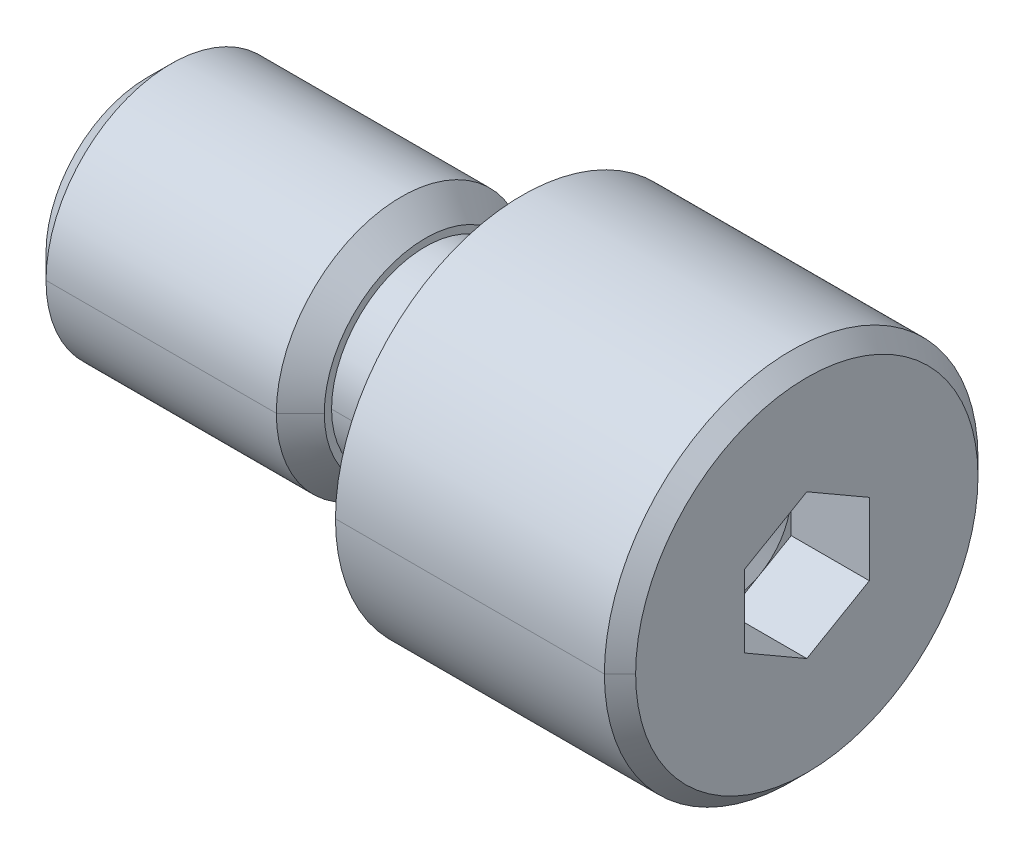
ISO-10303-21;
HEADER;
FILE_DESCRIPTION(('STEP AP214'),'2;1');
FILE_NAME('part.step','',(''),(''),'','','');
FILE_SCHEMA(('AUTOMOTIVE_DESIGN { 1 0 10303 214 1 1 1 1 }'));
ENDSEC;
DATA;
#1=APPLICATION_CONTEXT('core data for automotive mechanical design processes');
#2=APPLICATION_PROTOCOL_DEFINITION('international standard','automotive_design',2000,#1);
#3=PRODUCT_CONTEXT('',#1,'mechanical');
#4=PRODUCT('Part','Part','',(#3));
#5=PRODUCT_RELATED_PRODUCT_CATEGORY('part','',(#4));
#6=PRODUCT_DEFINITION_FORMATION('','',#4);
#7=PRODUCT_DEFINITION_CONTEXT('part definition',#1,'design');
#8=PRODUCT_DEFINITION('design','',#6,#7);
#9=PRODUCT_DEFINITION_SHAPE('','',#8);
#10=(LENGTH_UNIT() NAMED_UNIT(*) SI_UNIT(.MILLI.,.METRE.));
#11=(NAMED_UNIT(*) PLANE_ANGLE_UNIT() SI_UNIT($,.RADIAN.));
#12=(NAMED_UNIT(*) SI_UNIT($,.STERADIAN.) SOLID_ANGLE_UNIT());
#13=UNCERTAINTY_MEASURE_WITH_UNIT(LENGTH_MEASURE(1.E-05),#10,'distance_accuracy_value','');
#14=(GEOMETRIC_REPRESENTATION_CONTEXT(3) GLOBAL_UNCERTAINTY_ASSIGNED_CONTEXT((#13)) GLOBAL_UNIT_ASSIGNED_CONTEXT((#10,
#11,#12)) REPRESENTATION_CONTEXT('',''));
#15=CARTESIAN_POINT('',(0.,0.,0.));
#16=DIRECTION('',(0.,0.,1.));
#17=DIRECTION('',(1.,0.,0.));
#18=AXIS2_PLACEMENT_3D('',#15,#16,#17);
#19=CARTESIAN_POINT('',(18.6,0.,0.));
#20=DIRECTION('',(1.,0.,0.));
#21=DIRECTION('',(0.,0.,-1.));
#22=AXIS2_PLACEMENT_3D('',#19,#20,#21);
#23=PLANE('',#22);
#24=DIRECTION('',(0.,0.499999999999983,-0.866025403784448));
#25=VECTOR('',#24,1.);
#26=CARTESIAN_POINT('',(18.6,-2.3094010767585,0.));
#27=LINE('',#26,#25);
#28=CARTESIAN_POINT('',(18.6,-2.3094010767585,0.));
#29=VERTEX_POINT('',#28);
#30=CARTESIAN_POINT('',(18.6,-1.73205080756889,-0.999999999999966));
#31=VERTEX_POINT('',#30);
#32=EDGE_CURVE('E11',#29,#31,#27,.T.);
#33=ORIENTED_EDGE('',*,*,#32,.T.);
#34=CARTESIAN_POINT('',(18.6,0.,0.));
#35=DIRECTION('',(-1.,0.,0.));
#36=DIRECTION('',(0.,0.,-1.));
#37=AXIS2_PLACEMENT_3D('',#34,#35,#36);
#38=CIRCLE('',#37,2.);
#39=CARTESIAN_POINT('',(18.6,-1.73205080756889,0.999999999999966));
#40=VERTEX_POINT('',#39);
#41=EDGE_CURVE('E25',#31,#40,#38,.T.);
#42=ORIENTED_EDGE('',*,*,#41,.T.);
#43=DIRECTION('',(0.,-0.499999999999983,-0.866025403784448));
#44=VECTOR('',#43,1.);
#45=CARTESIAN_POINT('',(18.6,-1.1547005383793,2.));
#46=LINE('',#45,#44);
#47=EDGE_CURVE('E459',#40,#29,#46,.T.);
#48=ORIENTED_EDGE('',*,*,#47,.T.);
#49=EDGE_LOOP('',(#33,#42,#48));
#50=FACE_BOUND('',#49,.T.);
#51=ADVANCED_FACE('F17',(#50),#23,.T.);
#52=CARTESIAN_POINT('',(18.6,-1.1547005383793,2.));
#53=DIRECTION('',(0.,-0.866025403784448,0.499999999999983));
#54=DIRECTION('',(0.,-0.499999999999983,-0.866025403784448));
#55=AXIS2_PLACEMENT_3D('',#52,#53,#54);
#56=PLANE('',#55);
#57=DIRECTION('',(0.,-0.499999999999983,-0.866025403784448));
#58=VECTOR('',#57,1.);
#59=CARTESIAN_POINT('',(21.1,-1.1547005383793,2.));
#60=LINE('',#59,#58);
#61=CARTESIAN_POINT('',(21.1,-1.1547005383793,2.));
#62=VERTEX_POINT('',#61);
#63=CARTESIAN_POINT('',(21.1,-2.3094010767585,0.));
#64=VERTEX_POINT('',#63);
#65=EDGE_CURVE('E455',#62,#64,#60,.T.);
#66=ORIENTED_EDGE('',*,*,#65,.T.);
#67=DIRECTION('',(1.,0.,0.));
#68=VECTOR('',#67,1.);
#69=CARTESIAN_POINT('',(18.6,-2.3094010767585,0.));
#70=LINE('',#69,#68);
#71=EDGE_CURVE('E450',#29,#64,#70,.T.);
#72=ORIENTED_EDGE('',*,*,#71,.F.);
#73=ORIENTED_EDGE('',*,*,#47,.F.);
#74=DIRECTION('',(0.,-0.499999999999983,-0.866025403784448));
#75=VECTOR('',#74,1.);
#76=CARTESIAN_POINT('',(18.6,-1.1547005383793,2.));
#77=LINE('',#76,#75);
#78=CARTESIAN_POINT('',(18.6,-1.1547005383793,2.));
#79=VERTEX_POINT('',#78);
#80=EDGE_CURVE('E445',#79,#40,#77,.T.);
#81=ORIENTED_EDGE('',*,*,#80,.F.);
#82=DIRECTION('',(1.,0.,0.));
#83=VECTOR('',#82,1.);
#84=CARTESIAN_POINT('',(18.6,-1.1547005383793,2.));
#85=LINE('',#84,#83);
#86=EDGE_CURVE('E441',#79,#62,#85,.T.);
#87=ORIENTED_EDGE('',*,*,#86,.T.);
#88=EDGE_LOOP('',(#66,#72,#73,#81,#87));
#89=FACE_BOUND('',#88,.T.);
#90=ADVANCED_FACE('F470',(#89),#56,.F.);
#91=CARTESIAN_POINT('',(18.6,1.1547005383793,2.));
#92=DIRECTION('',(0.,0.,1.));
#93=DIRECTION('',(1.,0.,0.));
#94=AXIS2_PLACEMENT_3D('',#91,#92,#93);
#95=PLANE('',#94);
#96=DIRECTION('',(0.,-1.,0.));
#97=VECTOR('',#96,1.);
#98=CARTESIAN_POINT('',(21.1,1.1547005383793,2.));
#99=LINE('',#98,#97);
#100=CARTESIAN_POINT('',(21.1,1.1547005383793,2.));
#101=VERTEX_POINT('',#100);
#102=EDGE_CURVE('E436',#101,#62,#99,.T.);
#103=ORIENTED_EDGE('',*,*,#102,.T.);
#104=ORIENTED_EDGE('',*,*,#86,.F.);
#105=DIRECTION('',(0.,-1.,0.));
#106=VECTOR('',#105,1.);
#107=CARTESIAN_POINT('',(18.6,1.1547005383793,2.));
#108=LINE('',#107,#106);
#109=CARTESIAN_POINT('',(18.6,0.,2.));
#110=VERTEX_POINT('',#109);
#111=EDGE_CURVE('E431',#110,#79,#108,.T.);
#112=ORIENTED_EDGE('',*,*,#111,.F.);
#113=DIRECTION('',(0.,-1.,0.));
#114=VECTOR('',#113,1.);
#115=CARTESIAN_POINT('',(18.6,1.1547005383793,2.));
#116=LINE('',#115,#114);
#117=CARTESIAN_POINT('',(18.6,1.1547005383793,2.));
#118=VERTEX_POINT('',#117);
#119=EDGE_CURVE('E426',#118,#110,#116,.T.);
#120=ORIENTED_EDGE('',*,*,#119,.F.);
#121=DIRECTION('',(1.,0.,0.));
#122=VECTOR('',#121,1.);
#123=CARTESIAN_POINT('',(18.6,1.1547005383793,2.));
#124=LINE('',#123,#122);
#125=EDGE_CURVE('E422',#118,#101,#124,.T.);
#126=ORIENTED_EDGE('',*,*,#125,.T.);
#127=EDGE_LOOP('',(#103,#104,#112,#120,#126));
#128=FACE_BOUND('',#127,.T.);
#129=ADVANCED_FACE('F488',(#128),#95,.F.);
#130=CARTESIAN_POINT('',(18.6,2.3094010767585,0.));
#131=DIRECTION('',(0.,0.866025403784448,0.499999999999983));
#132=DIRECTION('',(0.,-0.499999999999983,0.866025403784448));
#133=AXIS2_PLACEMENT_3D('',#130,#131,#132);
#134=PLANE('',#133);
#135=DIRECTION('',(0.,-0.499999999999983,0.866025403784448));
#136=VECTOR('',#135,1.);
#137=CARTESIAN_POINT('',(21.1,2.3094010767585,0.));
#138=LINE('',#137,#136);
#139=CARTESIAN_POINT('',(21.1,2.3094010767585,0.));
#140=VERTEX_POINT('',#139);
#141=EDGE_CURVE('E417',#140,#101,#138,.T.);
#142=ORIENTED_EDGE('',*,*,#141,.T.);
#143=ORIENTED_EDGE('',*,*,#125,.F.);
#144=DIRECTION('',(0.,-0.499999999999983,0.866025403784448));
#145=VECTOR('',#144,1.);
#146=CARTESIAN_POINT('',(18.6,2.3094010767585,0.));
#147=LINE('',#146,#145);
#148=CARTESIAN_POINT('',(18.6,1.73205080756889,0.999999999999966));
#149=VERTEX_POINT('',#148);
#150=EDGE_CURVE('E412',#149,#118,#147,.T.);
#151=ORIENTED_EDGE('',*,*,#150,.F.);
#152=DIRECTION('',(0.,-0.499999999999983,0.866025403784448));
#153=VECTOR('',#152,1.);
#154=CARTESIAN_POINT('',(18.6,2.3094010767585,0.));
#155=LINE('',#154,#153);
#156=CARTESIAN_POINT('',(18.6,2.3094010767585,0.));
#157=VERTEX_POINT('',#156);
#158=EDGE_CURVE('E407',#157,#149,#155,.T.);
#159=ORIENTED_EDGE('',*,*,#158,.F.);
#160=DIRECTION('',(1.,0.,0.));
#161=VECTOR('',#160,1.);
#162=CARTESIAN_POINT('',(18.6,2.3094010767585,0.));
#163=LINE('',#162,#161);
#164=EDGE_CURVE('E403',#157,#140,#163,.T.);
#165=ORIENTED_EDGE('',*,*,#164,.T.);
#166=EDGE_LOOP('',(#142,#143,#151,#159,#165));
#167=FACE_BOUND('',#166,.T.);
#168=ADVANCED_FACE('F512',(#167),#134,.F.);
#169=CARTESIAN_POINT('',(18.6,1.1547005383793,-2.));
#170=DIRECTION('',(0.,0.866025403784448,-0.499999999999983));
#171=DIRECTION('',(0.,0.499999999999983,0.866025403784448));
#172=AXIS2_PLACEMENT_3D('',#169,#170,#171);
#173=PLANE('',#172);
#174=DIRECTION('',(0.,0.499999999999983,0.866025403784448));
#175=VECTOR('',#174,1.);
#176=CARTESIAN_POINT('',(21.1,1.1547005383793,-2.));
#177=LINE('',#176,#175);
#178=CARTESIAN_POINT('',(21.1,1.1547005383793,-2.));
#179=VERTEX_POINT('',#178);
#180=EDGE_CURVE('E398',#179,#140,#177,.T.);
#181=ORIENTED_EDGE('',*,*,#180,.T.);
#182=ORIENTED_EDGE('',*,*,#164,.F.);
#183=DIRECTION('',(0.,0.499999999999983,0.866025403784448));
#184=VECTOR('',#183,1.);
#185=CARTESIAN_POINT('',(18.6,1.1547005383793,-2.));
#186=LINE('',#185,#184);
#187=CARTESIAN_POINT('',(18.6,1.73205080756889,-0.999999999999966));
#188=VERTEX_POINT('',#187);
#189=EDGE_CURVE('E393',#188,#157,#186,.T.);
#190=ORIENTED_EDGE('',*,*,#189,.F.);
#191=DIRECTION('',(0.,0.499999999999983,0.866025403784448));
#192=VECTOR('',#191,1.);
#193=CARTESIAN_POINT('',(18.6,1.1547005383793,-2.));
#194=LINE('',#193,#192);
#195=CARTESIAN_POINT('',(18.6,1.1547005383793,-2.));
#196=VERTEX_POINT('',#195);
#197=EDGE_CURVE('E388',#196,#188,#194,.T.);
#198=ORIENTED_EDGE('',*,*,#197,.F.);
#199=DIRECTION('',(1.,0.,0.));
#200=VECTOR('',#199,1.);
#201=CARTESIAN_POINT('',(18.6,1.1547005383793,-2.));
#202=LINE('',#201,#200);
#203=EDGE_CURVE('E384',#196,#179,#202,.T.);
#204=ORIENTED_EDGE('',*,*,#203,.T.);
#205=EDGE_LOOP('',(#181,#182,#190,#198,#204));
#206=FACE_BOUND('',#205,.T.);
#207=ADVANCED_FACE('F514',(#206),#173,.F.);
#208=CARTESIAN_POINT('',(18.6,-1.1547005383793,-2.));
#209=DIRECTION('',(0.,0.,-1.));
#210=DIRECTION('',(-1.,0.,0.));
#211=AXIS2_PLACEMENT_3D('',#208,#209,#210);
#212=PLANE('',#211);
#213=DIRECTION('',(0.,1.,0.));
#214=VECTOR('',#213,1.);
#215=CARTESIAN_POINT('',(21.1,-1.1547005383793,-2.));
#216=LINE('',#215,#214);
#217=CARTESIAN_POINT('',(21.1,-1.1547005383793,-2.));
#218=VERTEX_POINT('',#217);
#219=EDGE_CURVE('E379',#218,#179,#216,.T.);
#220=ORIENTED_EDGE('',*,*,#219,.T.);
#221=ORIENTED_EDGE('',*,*,#203,.F.);
#222=DIRECTION('',(0.,1.,0.));
#223=VECTOR('',#222,1.);
#224=CARTESIAN_POINT('',(18.6,-1.1547005383793,-2.));
#225=LINE('',#224,#223);
#226=CARTESIAN_POINT('',(18.6,0.,-2.));
#227=VERTEX_POINT('',#226);
#228=EDGE_CURVE('E374',#227,#196,#225,.T.);
#229=ORIENTED_EDGE('',*,*,#228,.F.);
#230=DIRECTION('',(0.,1.,0.));
#231=VECTOR('',#230,1.);
#232=CARTESIAN_POINT('',(18.6,-1.1547005383793,-2.));
#233=LINE('',#232,#231);
#234=CARTESIAN_POINT('',(18.6,-1.1547005383793,-2.));
#235=VERTEX_POINT('',#234);
#236=EDGE_CURVE('E369',#235,#227,#233,.T.);
#237=ORIENTED_EDGE('',*,*,#236,.F.);
#238=DIRECTION('',(1.,0.,0.));
#239=VECTOR('',#238,1.);
#240=CARTESIAN_POINT('',(18.6,-1.1547005383793,-2.));
#241=LINE('',#240,#239);
#242=EDGE_CURVE('E365',#235,#218,#241,.T.);
#243=ORIENTED_EDGE('',*,*,#242,.T.);
#244=EDGE_LOOP('',(#220,#221,#229,#237,#243));
#245=FACE_BOUND('',#244,.T.);
#246=ADVANCED_FACE('F498',(#245),#212,.F.);
#247=CARTESIAN_POINT('',(18.6,-2.3094010767585,0.));
#248=DIRECTION('',(0.,-0.866025403784448,-0.499999999999983));
#249=DIRECTION('',(0.,0.499999999999983,-0.866025403784448));
#250=AXIS2_PLACEMENT_3D('',#247,#248,#249);
#251=PLANE('',#250);
#252=DIRECTION('',(0.,0.499999999999983,-0.866025403784448));
#253=VECTOR('',#252,1.);
#254=CARTESIAN_POINT('',(21.1,-2.3094010767585,0.));
#255=LINE('',#254,#253);
#256=EDGE_CURVE('E360',#64,#218,#255,.T.);
#257=ORIENTED_EDGE('',*,*,#256,.T.);
#258=ORIENTED_EDGE('',*,*,#242,.F.);
#259=DIRECTION('',(0.,0.499999999999983,-0.866025403784448));
#260=VECTOR('',#259,1.);
#261=CARTESIAN_POINT('',(18.6,-2.3094010767585,0.));
#262=LINE('',#261,#260);
#263=EDGE_CURVE('E355',#31,#235,#262,.T.);
#264=ORIENTED_EDGE('',*,*,#263,.F.);
#265=ORIENTED_EDGE('',*,*,#32,.F.);
#266=ORIENTED_EDGE('',*,*,#71,.T.);
#267=EDGE_LOOP('',(#257,#258,#264,#265,#266));
#268=FACE_BOUND('',#267,.T.);
#269=ADVANCED_FACE('F475',(#268),#251,.F.);
#270=CARTESIAN_POINT('',(18.6,0.,0.));
#271=DIRECTION('',(1.,0.,0.));
#272=DIRECTION('',(0.,0.,-1.));
#273=AXIS2_PLACEMENT_3D('',#270,#271,#272);
#274=PLANE('',#273);
#275=ORIENTED_EDGE('',*,*,#236,.T.);
#276=CARTESIAN_POINT('',(18.6,0.,0.));
#277=DIRECTION('',(-1.,0.,0.));
#278=DIRECTION('',(0.,0.,-1.));
#279=AXIS2_PLACEMENT_3D('',#276,#277,#278);
#280=CIRCLE('',#279,2.);
#281=EDGE_CURVE('E350',#227,#31,#280,.T.);
#282=ORIENTED_EDGE('',*,*,#281,.T.);
#283=ORIENTED_EDGE('',*,*,#263,.T.);
#284=EDGE_LOOP('',(#275,#282,#283));
#285=FACE_BOUND('',#284,.T.);
#286=ADVANCED_FACE('F479',(#285),#274,.T.);
#287=CARTESIAN_POINT('',(17.445299461621,0.,0.));
#288=DIRECTION('',(1.,0.,0.));
#289=DIRECTION('',(0.,1.,0.));
#290=AXIS2_PLACEMENT_3D('',#287,#288,#289);
#291=CONICAL_SURFACE('',#290,0.,1.04719755119669);
#292=DIRECTION('',(0.499999999999918,0.,0.866025403784486));
#293=VECTOR('',#292,1.);
#294=CARTESIAN_POINT('',(17.445299461621,0.,0.));
#295=LINE('',#294,#293);
#296=CARTESIAN_POINT('',(17.445299461621,0.,0.));
#297=VERTEX_POINT('',#296);
#298=EDGE_CURVE('E345',#297,#110,#295,.T.);
#299=ORIENTED_EDGE('',*,*,#298,.T.);
#300=CARTESIAN_POINT('',(18.6,0.,0.));
#301=DIRECTION('',(-1.,0.,0.));
#302=DIRECTION('',(0.,0.,-1.));
#303=AXIS2_PLACEMENT_3D('',#300,#301,#302);
#304=CIRCLE('',#303,2.);
#305=EDGE_CURVE('E340',#40,#110,#304,.T.);
#306=ORIENTED_EDGE('',*,*,#305,.F.);
#307=ORIENTED_EDGE('',*,*,#41,.F.);
#308=ORIENTED_EDGE('',*,*,#281,.F.);
#309=DIRECTION('',(0.499999999999918,0.,-0.866025403784486));
#310=VECTOR('',#309,1.);
#311=CARTESIAN_POINT('',(17.445299461621,0.,0.));
#312=LINE('',#311,#310);
#313=EDGE_CURVE('E335',#297,#227,#312,.T.);
#314=ORIENTED_EDGE('',*,*,#313,.F.);
#315=EDGE_LOOP('',(#299,#306,#307,#308,#314));
#316=FACE_BOUND('',#315,.T.);
#317=ADVANCED_FACE('F481',(#316),#291,.F.);
#318=CARTESIAN_POINT('',(17.445299461621,0.,0.));
#319=DIRECTION('',(1.,0.,0.));
#320=DIRECTION('',(0.,-1.,0.));
#321=AXIS2_PLACEMENT_3D('',#318,#319,#320);
#322=CONICAL_SURFACE('',#321,0.,1.04719755119669);
#323=ORIENTED_EDGE('',*,*,#313,.T.);
#324=CARTESIAN_POINT('',(18.6,0.,0.));
#325=DIRECTION('',(-1.,0.,0.));
#326=DIRECTION('',(0.,0.,-1.));
#327=AXIS2_PLACEMENT_3D('',#324,#325,#326);
#328=CIRCLE('',#327,2.);
#329=EDGE_CURVE('E330',#188,#227,#328,.T.);
#330=ORIENTED_EDGE('',*,*,#329,.F.);
#331=CARTESIAN_POINT('',(18.6,0.,0.));
#332=DIRECTION('',(-1.,0.,0.));
#333=DIRECTION('',(0.,0.,-1.));
#334=AXIS2_PLACEMENT_3D('',#331,#332,#333);
#335=CIRCLE('',#334,2.);
#336=EDGE_CURVE('E325',#149,#188,#335,.T.);
#337=ORIENTED_EDGE('',*,*,#336,.F.);
#338=CARTESIAN_POINT('',(18.6,0.,0.));
#339=DIRECTION('',(-1.,0.,0.));
#340=DIRECTION('',(0.,0.,-1.));
#341=AXIS2_PLACEMENT_3D('',#338,#339,#340);
#342=CIRCLE('',#341,2.);
#343=EDGE_CURVE('E320',#110,#149,#342,.T.);
#344=ORIENTED_EDGE('',*,*,#343,.F.);
#345=ORIENTED_EDGE('',*,*,#298,.F.);
#346=EDGE_LOOP('',(#323,#330,#337,#344,#345));
#347=FACE_BOUND('',#346,.T.);
#348=ADVANCED_FACE('F504',(#347),#322,.F.);
#349=CARTESIAN_POINT('',(18.6,0.,0.));
#350=DIRECTION('',(1.,0.,0.));
#351=DIRECTION('',(0.,0.,-1.));
#352=AXIS2_PLACEMENT_3D('',#349,#350,#351);
#353=PLANE('',#352);
#354=ORIENTED_EDGE('',*,*,#119,.T.);
#355=ORIENTED_EDGE('',*,*,#343,.T.);
#356=ORIENTED_EDGE('',*,*,#150,.T.);
#357=EDGE_LOOP('',(#354,#355,#356));
#358=FACE_BOUND('',#357,.T.);
#359=ADVANCED_FACE('F507',(#358),#353,.T.);
#360=CARTESIAN_POINT('',(18.6,0.,0.));
#361=DIRECTION('',(1.,0.,0.));
#362=DIRECTION('',(0.,0.,-1.));
#363=AXIS2_PLACEMENT_3D('',#360,#361,#362);
#364=PLANE('',#363);
#365=ORIENTED_EDGE('',*,*,#158,.T.);
#366=ORIENTED_EDGE('',*,*,#336,.T.);
#367=ORIENTED_EDGE('',*,*,#189,.T.);
#368=EDGE_LOOP('',(#365,#366,#367));
#369=FACE_BOUND('',#368,.T.);
#370=ADVANCED_FACE('F509',(#369),#364,.T.);
#371=CARTESIAN_POINT('',(18.6,0.,0.));
#372=DIRECTION('',(1.,0.,0.));
#373=DIRECTION('',(0.,0.,-1.));
#374=AXIS2_PLACEMENT_3D('',#371,#372,#373);
#375=PLANE('',#374);
#376=ORIENTED_EDGE('',*,*,#197,.T.);
#377=ORIENTED_EDGE('',*,*,#329,.T.);
#378=ORIENTED_EDGE('',*,*,#228,.T.);
#379=EDGE_LOOP('',(#376,#377,#378));
#380=FACE_BOUND('',#379,.T.);
#381=ADVANCED_FACE('F501',(#380),#375,.T.);
#382=CARTESIAN_POINT('',(18.6,0.,0.));
#383=DIRECTION('',(1.,0.,0.));
#384=DIRECTION('',(0.,0.,-1.));
#385=AXIS2_PLACEMENT_3D('',#382,#383,#384);
#386=PLANE('',#385);
#387=ORIENTED_EDGE('',*,*,#80,.T.);
#388=ORIENTED_EDGE('',*,*,#305,.T.);
#389=ORIENTED_EDGE('',*,*,#111,.T.);
#390=EDGE_LOOP('',(#387,#388,#389));
#391=FACE_BOUND('',#390,.T.);
#392=ADVANCED_FACE('F484',(#391),#386,.T.);
#393=CARTESIAN_POINT('',(21.1,5.475,0.));
#394=DIRECTION('',(-1.,0.,0.));
#395=DIRECTION('',(0.,0.,1.));
#396=AXIS2_PLACEMENT_3D('',#393,#394,#395);
#397=PLANE('',#396);
#398=ORIENTED_EDGE('',*,*,#141,.F.);
#399=ORIENTED_EDGE('',*,*,#180,.F.);
#400=ORIENTED_EDGE('',*,*,#219,.F.);
#401=ORIENTED_EDGE('',*,*,#256,.F.);
#402=ORIENTED_EDGE('',*,*,#65,.F.);
#403=ORIENTED_EDGE('',*,*,#102,.F.);
#404=EDGE_LOOP('',(#398,#399,#400,#401,#402,#403));
#405=FACE_BOUND('',#404,.T.);
#406=CARTESIAN_POINT('',(21.1,0.,0.));
#407=DIRECTION('',(1.,0.,0.));
#408=DIRECTION('',(0.,0.,-1.));
#409=AXIS2_PLACEMENT_3D('',#406,#407,#408);
#410=CIRCLE('',#409,5.475);
#411=CARTESIAN_POINT('',(21.1,0.,-5.475));
#412=VERTEX_POINT('',#411);
#413=CARTESIAN_POINT('',(21.1,0.,5.475));
#414=VERTEX_POINT('',#413);
#415=EDGE_CURVE('E316',#412,#414,#410,.T.);
#416=ORIENTED_EDGE('',*,*,#415,.T.);
#417=CARTESIAN_POINT('',(21.1,0.,0.));
#418=DIRECTION('',(1.,0.,0.));
#419=DIRECTION('',(0.,0.,-1.));
#420=AXIS2_PLACEMENT_3D('',#417,#418,#419);
#421=CIRCLE('',#420,5.475);
#422=EDGE_CURVE('E312',#414,#412,#421,.T.);
#423=ORIENTED_EDGE('',*,*,#422,.T.);
#424=EDGE_LOOP('',(#416,#423));
#425=FACE_BOUND('',#424,.T.);
#426=ADVANCED_FACE('F492',(#405,#425),#397,.F.);
#427=CARTESIAN_POINT('',(20.6,0.,0.));
#428=DIRECTION('',(-1.,0.,0.));
#429=DIRECTION('',(0.,1.,0.));
#430=AXIS2_PLACEMENT_3D('',#427,#428,#429);
#431=CONICAL_SURFACE('',#430,5.975,0.785398163397448);
#432=DIRECTION('',(-0.707106781186548,0.,-0.707106781186547));
#433=VECTOR('',#432,1.);
#434=CARTESIAN_POINT('',(21.1,0.,-5.475));
#435=LINE('',#434,#433);
#436=CARTESIAN_POINT('',(20.6,0.,-5.975));
#437=VERTEX_POINT('',#436);
#438=EDGE_CURVE('E307',#412,#437,#435,.T.);
#439=ORIENTED_EDGE('',*,*,#438,.F.);
#440=ORIENTED_EDGE('',*,*,#422,.F.);
#441=DIRECTION('',(-0.707106781186548,0.,0.707106781186547));
#442=VECTOR('',#441,1.);
#443=CARTESIAN_POINT('',(21.1,0.,5.475));
#444=LINE('',#443,#442);
#445=CARTESIAN_POINT('',(20.6,0.,5.975));
#446=VERTEX_POINT('',#445);
#447=EDGE_CURVE('E303',#414,#446,#444,.T.);
#448=ORIENTED_EDGE('',*,*,#447,.T.);
#449=CARTESIAN_POINT('',(20.6,0.,0.));
#450=DIRECTION('',(1.,0.,0.));
#451=DIRECTION('',(0.,0.,-1.));
#452=AXIS2_PLACEMENT_3D('',#449,#450,#451);
#453=CIRCLE('',#452,5.975);
#454=EDGE_CURVE('E299',#446,#437,#453,.T.);
#455=ORIENTED_EDGE('',*,*,#454,.T.);
#456=EDGE_LOOP('',(#439,#440,#448,#455));
#457=FACE_BOUND('',#456,.T.);
#458=ADVANCED_FACE('F637',(#457),#431,.T.);
#459=CARTESIAN_POINT('',(21.1,0.,0.));
#460=DIRECTION('',(1.,0.,0.));
#461=DIRECTION('',(0.,1.,0.));
#462=AXIS2_PLACEMENT_3D('',#459,#460,#461);
#463=CYLINDRICAL_SURFACE('',#462,5.975);
#464=DIRECTION('',(1.,0.,0.));
#465=VECTOR('',#464,1.);
#466=CARTESIAN_POINT('',(12.,0.,5.975));
#467=LINE('',#466,#465);
#468=CARTESIAN_POINT('',(12.,0.,5.975));
#469=VERTEX_POINT('',#468);
#470=EDGE_CURVE('E294',#469,#446,#467,.T.);
#471=ORIENTED_EDGE('',*,*,#470,.F.);
#472=CARTESIAN_POINT('',(12.,0.,0.));
#473=DIRECTION('',(1.,0.,0.));
#474=DIRECTION('',(0.,0.,-1.));
#475=AXIS2_PLACEMENT_3D('',#472,#473,#474);
#476=CIRCLE('',#475,5.975);
#477=CARTESIAN_POINT('',(12.,0.,-5.975));
#478=VERTEX_POINT('',#477);
#479=EDGE_CURVE('E290',#469,#478,#476,.T.);
#480=ORIENTED_EDGE('',*,*,#479,.T.);
#481=DIRECTION('',(1.,0.,0.));
#482=VECTOR('',#481,1.);
#483=CARTESIAN_POINT('',(12.,0.,-5.975));
#484=LINE('',#483,#482);
#485=EDGE_CURVE('E285',#478,#437,#484,.T.);
#486=ORIENTED_EDGE('',*,*,#485,.T.);
#487=ORIENTED_EDGE('',*,*,#454,.F.);
#488=EDGE_LOOP('',(#471,#480,#486,#487));
#489=FACE_BOUND('',#488,.T.);
#490=ADVANCED_FACE('F647',(#489),#463,.T.);
#491=CARTESIAN_POINT('',(21.1,0.,0.));
#492=DIRECTION('',(1.,0.,0.));
#493=DIRECTION('',(0.,-1.,0.));
#494=AXIS2_PLACEMENT_3D('',#491,#492,#493);
#495=CYLINDRICAL_SURFACE('',#494,5.975);
#496=ORIENTED_EDGE('',*,*,#470,.T.);
#497=CARTESIAN_POINT('',(20.6,0.,0.));
#498=DIRECTION('',(1.,0.,0.));
#499=DIRECTION('',(0.,0.,-1.));
#500=AXIS2_PLACEMENT_3D('',#497,#498,#499);
#501=CIRCLE('',#500,5.975);
#502=EDGE_CURVE('E280',#437,#446,#501,.T.);
#503=ORIENTED_EDGE('',*,*,#502,.F.);
#504=ORIENTED_EDGE('',*,*,#485,.F.);
#505=CARTESIAN_POINT('',(12.,0.,0.));
#506=DIRECTION('',(1.,0.,0.));
#507=DIRECTION('',(0.,0.,-1.));
#508=AXIS2_PLACEMENT_3D('',#505,#506,#507);
#509=CIRCLE('',#508,5.975);
#510=EDGE_CURVE('E277',#478,#469,#509,.T.);
#511=ORIENTED_EDGE('',*,*,#510,.T.);
#512=EDGE_LOOP('',(#496,#503,#504,#511));
#513=FACE_BOUND('',#512,.T.);
#514=ADVANCED_FACE('F258',(#513),#495,.T.);
#515=CARTESIAN_POINT('',(12.,0.,0.));
#516=DIRECTION('',(1.,0.,0.));
#517=DIRECTION('',(0.,0.,-1.));
#518=AXIS2_PLACEMENT_3D('',#515,#516,#517);
#519=PLANE('',#518);
#520=ORIENTED_EDGE('',*,*,#479,.F.);
#521=ORIENTED_EDGE('',*,*,#510,.F.);
#522=EDGE_LOOP('',(#520,#521));
#523=FACE_BOUND('',#522,.T.);
#524=CARTESIAN_POINT('',(12.,-3.04338085214449,-0.988854381999831));
#525=CARTESIAN_POINT('',(12.,-2.73243190209042,-1.9445355101349));
#526=CARTESIAN_POINT('',(12.,-2.04786410707158,-2.78084010409957));
#527=CARTESIAN_POINT('',(12.,-1.04545983430225,-3.29028997998312));
#528=CARTESIAN_POINT('',(12.,1.11054933170743,-3.41791939541695));
#529=CARTESIAN_POINT('',(12.,2.77977869888671,-2.04739463776096));
#530=CARTESIAN_POINT('',(12.,3.29129366696459,-1.04604258202018));
#531=CARTESIAN_POINT('',(12.,3.35355314017973,0.0329209010775271));
#532=CARTESIAN_POINT('',(12.,3.04338085214449,0.988854381999831));
#533=B_SPLINE_CURVE_WITH_KNOTS('',5,(#524,#525,#526,#527,#528,#529,#530,#531,#532),
.UNSPECIFIED.,.F.,.F.,(6,3,6),(0.,1.5707963267949,3.14159265358979),.UNSPECIFIED.);
#534=CARTESIAN_POINT('',(12.,-3.04338085214501,-0.988854382));
#535=VERTEX_POINT('',#534);
#536=CARTESIAN_POINT('',(12.,3.04338085214501,0.988854382));
#537=VERTEX_POINT('',#536);
#538=EDGE_CURVE('E275',#535,#537,#533,.T.);
#539=ORIENTED_EDGE('',*,*,#538,.T.);
#540=CARTESIAN_POINT('',(12.,0.,0.));
#541=DIRECTION('',(1.,0.,0.));
#542=DIRECTION('',(0.,0.,-1.));
#543=AXIS2_PLACEMENT_3D('',#540,#541,#542);
#544=CIRCLE('',#543,3.2);
#545=EDGE_CURVE('E899',#537,#535,#544,.T.);
#546=ORIENTED_EDGE('',*,*,#545,.T.);
#547=EDGE_LOOP('',(#539,#546));
#548=FACE_BOUND('',#547,.T.);
#549=ADVANCED_FACE('F253',(#523,#548),#519,.F.);
#550=CARTESIAN_POINT('',(11.7999999999995,0.,0.));
#551=DIRECTION('',(1.,0.,0.));
#552=DIRECTION('',(0.,0.309016994374947,-0.951056516295154));
#553=AXIS2_PLACEMENT_3D('',#550,#551,#552);
#554=TOROIDAL_SURFACE('',#553,3.20000000000055,0.200000000000544);
#555=CARTESIAN_POINT('',(11.7999999999995,-3.04338085214501,-0.988854382));
#556=DIRECTION('',(0.,0.309016994374948,-0.951056516295154));
#557=DIRECTION('',(2.69118061168406E-12,0.951056516295154,0.309016994374948));
#558=AXIS2_PLACEMENT_3D('',#555,#556,#557);
#559=CIRCLE('',#558,0.200000000000544);
#560=CARTESIAN_POINT('',(11.8,-2.85316954888546,-0.927050983124842));
#561=VERTEX_POINT('',#560);
#562=EDGE_CURVE('E894',#561,#535,#559,.T.);
#563=ORIENTED_EDGE('',*,*,#562,.T.);
#564=ORIENTED_EDGE('',*,*,#545,.F.);
#565=CARTESIAN_POINT('',(11.7999999999995,3.04338085214501,0.988854382));
#566=DIRECTION('',(0.,-0.309016994374948,0.951056516295154));
#567=DIRECTION('',(2.69118061168406E-12,-0.951056516295154,-0.309016994374948));
#568=AXIS2_PLACEMENT_3D('',#565,#566,#567);
#569=CIRCLE('',#568,0.200000000000544);
#570=CARTESIAN_POINT('',(11.8,2.85316954888546,0.927050983124842));
#571=VERTEX_POINT('',#570);
#572=EDGE_CURVE('E890',#571,#537,#569,.T.);
#573=ORIENTED_EDGE('',*,*,#572,.F.);
#574=CARTESIAN_POINT('',(11.8,0.,0.));
#575=DIRECTION('',(1.,0.,0.));
#576=DIRECTION('',(0.,0.,-1.));
#577=AXIS2_PLACEMENT_3D('',#574,#575,#576);
#578=CIRCLE('',#577,3.);
#579=CARTESIAN_POINT('',(11.8,0.,3.));
#580=VERTEX_POINT('',#579);
#581=EDGE_CURVE('E886',#571,#580,#578,.T.);
#582=ORIENTED_EDGE('',*,*,#581,.T.);
#583=CARTESIAN_POINT('',(11.8,0.,0.));
#584=DIRECTION('',(1.,0.,0.));
#585=DIRECTION('',(0.,0.,-1.));
#586=AXIS2_PLACEMENT_3D('',#583,#584,#585);
#587=CIRCLE('',#586,3.);
#588=EDGE_CURVE('E874',#580,#561,#587,.T.);
#589=ORIENTED_EDGE('',*,*,#588,.T.);
#590=EDGE_LOOP('',(#563,#564,#573,#582,#589));
#591=FACE_BOUND('',#590,.T.);
#592=ADVANCED_FACE('F249',(#591),#554,.F.);
#593=CARTESIAN_POINT('',(12.,0.,0.));
#594=DIRECTION('',(1.,0.,0.));
#595=DIRECTION('',(0.,1.,0.));
#596=AXIS2_PLACEMENT_3D('',#593,#594,#595);
#597=CYLINDRICAL_SURFACE('',#596,3.);
#598=DIRECTION('',(1.,0.,0.));
#599=VECTOR('',#598,1.);
#600=CARTESIAN_POINT('',(8.9,0.,3.));
#601=LINE('',#600,#599);
#602=CARTESIAN_POINT('',(8.9,0.,3.));
#603=VERTEX_POINT('',#602);
#604=EDGE_CURVE('E870',#603,#580,#601,.T.);
#605=ORIENTED_EDGE('',*,*,#604,.F.);
#606=CARTESIAN_POINT('',(8.9,0.,0.));
#607=DIRECTION('',(1.,0.,0.));
#608=DIRECTION('',(0.,0.,-1.));
#609=AXIS2_PLACEMENT_3D('',#606,#607,#608);
#610=CIRCLE('',#609,3.);
#611=CARTESIAN_POINT('',(8.9,0.,-3.));
#612=VERTEX_POINT('',#611);
#613=EDGE_CURVE('E868',#603,#612,#610,.T.);
#614=ORIENTED_EDGE('',*,*,#613,.T.);
#615=DIRECTION('',(1.,0.,0.));
#616=VECTOR('',#615,1.);
#617=CARTESIAN_POINT('',(8.9,0.,-3.));
#618=LINE('',#617,#616);
#619=CARTESIAN_POINT('',(11.8,0.,-3.));
#620=VERTEX_POINT('',#619);
#621=EDGE_CURVE('E871',#612,#620,#618,.T.);
#622=ORIENTED_EDGE('',*,*,#621,.T.);
#623=CARTESIAN_POINT('',(11.8,0.,0.));
#624=DIRECTION('',(1.,0.,0.));
#625=DIRECTION('',(0.,0.,-1.));
#626=AXIS2_PLACEMENT_3D('',#623,#624,#625);
#627=CIRCLE('',#626,3.);
#628=EDGE_CURVE('E876',#561,#620,#627,.T.);
#629=ORIENTED_EDGE('',*,*,#628,.F.);
#630=ORIENTED_EDGE('',*,*,#588,.F.);
#631=EDGE_LOOP('',(#605,#614,#622,#629,#630));
#632=FACE_BOUND('',#631,.T.);
#633=ADVANCED_FACE('F244',(#632),#597,.T.);
#634=CARTESIAN_POINT('',(11.7999999999995,0.,0.));
#635=DIRECTION('',(1.,0.,0.));
#636=DIRECTION('',(0.,-0.309016994374947,0.951056516295154));
#637=AXIS2_PLACEMENT_3D('',#634,#635,#636);
#638=TOROIDAL_SURFACE('',#637,3.20000000000055,0.200000000000544);
#639=ORIENTED_EDGE('',*,*,#562,.F.);
#640=ORIENTED_EDGE('',*,*,#628,.T.);
#641=CARTESIAN_POINT('',(11.8,0.,0.));
#642=DIRECTION('',(1.,0.,0.));
#643=DIRECTION('',(0.,0.,-1.));
#644=AXIS2_PLACEMENT_3D('',#641,#642,#643);
#645=CIRCLE('',#644,3.);
#646=EDGE_CURVE('E224',#620,#571,#645,.T.);
#647=ORIENTED_EDGE('',*,*,#646,.T.);
#648=ORIENTED_EDGE('',*,*,#572,.T.);
#649=ORIENTED_EDGE('',*,*,#538,.F.);
#650=EDGE_LOOP('',(#639,#640,#647,#648,#649));
#651=FACE_BOUND('',#650,.T.);
#652=ADVANCED_FACE('F233',(#651),#638,.F.);
#653=CARTESIAN_POINT('',(12.,0.,0.));
#654=DIRECTION('',(1.,0.,0.));
#655=DIRECTION('',(0.,-1.,0.));
#656=AXIS2_PLACEMENT_3D('',#653,#654,#655);
#657=CYLINDRICAL_SURFACE('',#656,3.);
#658=ORIENTED_EDGE('',*,*,#604,.T.);
#659=ORIENTED_EDGE('',*,*,#581,.F.);
#660=ORIENTED_EDGE('',*,*,#646,.F.);
#661=ORIENTED_EDGE('',*,*,#621,.F.);
#662=CARTESIAN_POINT('',(8.9,0.,0.));
#663=DIRECTION('',(1.,0.,0.));
#664=DIRECTION('',(0.,0.,-1.));
#665=AXIS2_PLACEMENT_3D('',#662,#663,#664);
#666=CIRCLE('',#665,3.);
#667=EDGE_CURVE('E219',#612,#603,#666,.T.);
#668=ORIENTED_EDGE('',*,*,#667,.T.);
#669=EDGE_LOOP('',(#658,#659,#660,#661,#668));
#670=FACE_BOUND('',#669,.T.);
#671=ADVANCED_FACE('F243',(#670),#657,.T.);
#672=CARTESIAN_POINT('',(8.9,3.233,0.));
#673=DIRECTION('',(-1.,0.,0.));
#674=DIRECTION('',(0.,0.,1.));
#675=AXIS2_PLACEMENT_3D('',#672,#673,#674);
#676=PLANE('',#675);
#677=ORIENTED_EDGE('',*,*,#613,.F.);
#678=ORIENTED_EDGE('',*,*,#667,.F.);
#679=EDGE_LOOP('',(#677,#678));
#680=FACE_BOUND('',#679,.T.);
#681=CARTESIAN_POINT('',(8.9,0.,0.));
#682=DIRECTION('',(1.,0.,0.));
#683=DIRECTION('',(0.,0.,-1.));
#684=AXIS2_PLACEMENT_3D('',#681,#682,#683);
#685=CIRCLE('',#684,3.233);
#686=CARTESIAN_POINT('',(8.9,0.,-3.233));
#687=VERTEX_POINT('',#686);
#688=CARTESIAN_POINT('',(8.9,0.,3.233));
#689=VERTEX_POINT('',#688);
#690=EDGE_CURVE('E215',#687,#689,#685,.T.);
#691=ORIENTED_EDGE('',*,*,#690,.T.);
#692=CARTESIAN_POINT('',(8.9,0.,0.));
#693=DIRECTION('',(1.,0.,0.));
#694=DIRECTION('',(0.,0.,-1.));
#695=AXIS2_PLACEMENT_3D('',#692,#693,#694);
#696=CIRCLE('',#695,3.233);
#697=EDGE_CURVE('E211',#689,#687,#696,.T.);
#698=ORIENTED_EDGE('',*,*,#697,.T.);
#699=EDGE_LOOP('',(#691,#698));
#700=FACE_BOUND('',#699,.T.);
#701=ADVANCED_FACE('F704',(#680,#700),#676,.F.);
#702=CARTESIAN_POINT('',(8.133,0.,0.));
#703=DIRECTION('',(-1.,0.,0.));
#704=DIRECTION('',(0.,1.,0.));
#705=AXIS2_PLACEMENT_3D('',#702,#703,#704);
#706=CONICAL_SURFACE('',#705,4.,0.785398163397448);
#707=DIRECTION('',(-0.707106781186548,0.,-0.707106781186547));
#708=VECTOR('',#707,1.);
#709=CARTESIAN_POINT('',(8.9,0.,-3.233));
#710=LINE('',#709,#708);
#711=CARTESIAN_POINT('',(8.133,0.,-4.));
#712=VERTEX_POINT('',#711);
#713=EDGE_CURVE('E206',#687,#712,#710,.T.);
#714=ORIENTED_EDGE('',*,*,#713,.F.);
#715=ORIENTED_EDGE('',*,*,#697,.F.);
#716=DIRECTION('',(-0.707106781186548,0.,0.707106781186547));
#717=VECTOR('',#716,1.);
#718=CARTESIAN_POINT('',(8.9,0.,3.233));
#719=LINE('',#718,#717);
#720=CARTESIAN_POINT('',(8.133,0.,4.));
#721=VERTEX_POINT('',#720);
#722=EDGE_CURVE('E202',#689,#721,#719,.T.);
#723=ORIENTED_EDGE('',*,*,#722,.T.);
#724=CARTESIAN_POINT('',(8.133,0.,0.));
#725=DIRECTION('',(1.,0.,0.));
#726=DIRECTION('',(0.,0.,-1.));
#727=AXIS2_PLACEMENT_3D('',#724,#725,#726);
#728=CIRCLE('',#727,4.);
#729=EDGE_CURVE('E198',#721,#712,#728,.T.);
#730=ORIENTED_EDGE('',*,*,#729,.T.);
#731=EDGE_LOOP('',(#714,#715,#723,#730));
#732=FACE_BOUND('',#731,.T.);
#733=ADVANCED_FACE('F714',(#732),#706,.T.);
#734=CARTESIAN_POINT('',(12.,0.,0.));
#735=DIRECTION('',(1.,0.,0.));
#736=DIRECTION('',(0.,1.,-5.8935951136395E-10));
#737=AXIS2_PLACEMENT_3D('',#734,#735,#736);
#738=CYLINDRICAL_SURFACE('',#737,4.);
#739=DIRECTION('',(1.,0.,0.));
#740=VECTOR('',#739,1.);
#741=CARTESIAN_POINT('',(0.766999999999998,0.,4.));
#742=LINE('',#741,#740);
#743=CARTESIAN_POINT('',(0.767,0.,4.));
#744=VERTEX_POINT('',#743);
#745=EDGE_CURVE('E193',#744,#721,#742,.T.);
#746=ORIENTED_EDGE('',*,*,#745,.F.);
#747=CARTESIAN_POINT('',(0.767,0.,0.));
#748=DIRECTION('',(1.,0.,0.));
#749=DIRECTION('',(0.,0.,-1.));
#750=AXIS2_PLACEMENT_3D('',#747,#748,#749);
#751=CIRCLE('',#750,4.);
#752=CARTESIAN_POINT('',(0.767,0.,-4.));
#753=VERTEX_POINT('',#752);
#754=EDGE_CURVE('E169',#744,#753,#751,.T.);
#755=ORIENTED_EDGE('',*,*,#754,.T.);
#756=DIRECTION('',(1.,0.,0.));
#757=VECTOR('',#756,1.);
#758=CARTESIAN_POINT('',(0.767000000000003,0.,-4.));
#759=LINE('',#758,#757);
#760=EDGE_CURVE('E185',#753,#712,#759,.T.);
#761=ORIENTED_EDGE('',*,*,#760,.T.);
#762=ORIENTED_EDGE('',*,*,#729,.F.);
#763=EDGE_LOOP('',(#746,#755,#761,#762));
#764=FACE_BOUND('',#763,.T.);
#765=ADVANCED_FACE('F724',(#764),#738,.T.);
#766=CARTESIAN_POINT('',(12.,0.,0.));
#767=DIRECTION('',(1.,0.,0.));
#768=DIRECTION('',(0.,-1.,-5.8935951136395E-10));
#769=AXIS2_PLACEMENT_3D('',#766,#767,#768);
#770=CYLINDRICAL_SURFACE('',#769,4.);
#771=ORIENTED_EDGE('',*,*,#745,.T.);
#772=CARTESIAN_POINT('',(8.133,0.,0.));
#773=DIRECTION('',(1.,0.,0.));
#774=DIRECTION('',(0.,0.,-1.));
#775=AXIS2_PLACEMENT_3D('',#772,#773,#774);
#776=CIRCLE('',#775,4.);
#777=EDGE_CURVE('E173',#712,#721,#776,.T.);
#778=ORIENTED_EDGE('',*,*,#777,.F.);
#779=ORIENTED_EDGE('',*,*,#760,.F.);
#780=CARTESIAN_POINT('',(0.767,0.,0.));
#781=DIRECTION('',(1.,0.,0.));
#782=DIRECTION('',(0.,0.,-1.));
#783=AXIS2_PLACEMENT_3D('',#780,#781,#782);
#784=CIRCLE('',#783,4.);
#785=EDGE_CURVE('E170',#753,#744,#784,.T.);
#786=ORIENTED_EDGE('',*,*,#785,.T.);
#787=EDGE_LOOP('',(#771,#778,#779,#786));
#788=FACE_BOUND('',#787,.T.);
#789=ADVANCED_FACE('F735',(#788),#770,.T.);
#790=CARTESIAN_POINT('',(0.,0.,0.));
#791=DIRECTION('',(1.,0.,0.));
#792=DIRECTION('',(0.,-1.,0.));
#793=AXIS2_PLACEMENT_3D('',#790,#791,#792);
#794=CONICAL_SURFACE('',#793,3.233,0.785398163397448);
#795=DIRECTION('',(0.707106781186548,0.,0.707106781186547));
#796=VECTOR('',#795,1.);
#797=CARTESIAN_POINT('',(0.,0.,3.233));
#798=LINE('',#797,#796);
#799=CARTESIAN_POINT('',(0.,0.,3.233));
#800=VERTEX_POINT('',#799);
#801=EDGE_CURVE('E157',#800,#744,#798,.T.);
#802=ORIENTED_EDGE('',*,*,#801,.T.);
#803=ORIENTED_EDGE('',*,*,#785,.F.);
#804=DIRECTION('',(0.707106781186548,0.,-0.707106781186547));
#805=VECTOR('',#804,1.);
#806=CARTESIAN_POINT('',(0.,0.,-3.233));
#807=LINE('',#806,#805);
#808=CARTESIAN_POINT('',(0.,0.,-3.233));
#809=VERTEX_POINT('',#808);
#810=EDGE_CURVE('E160',#809,#753,#807,.T.);
#811=ORIENTED_EDGE('',*,*,#810,.F.);
#812=CARTESIAN_POINT('',(0.,0.,0.));
#813=DIRECTION('',(1.,0.,0.));
#814=DIRECTION('',(0.,0.,-1.));
#815=AXIS2_PLACEMENT_3D('',#812,#813,#814);
#816=CIRCLE('',#815,3.233);
#817=EDGE_CURVE('E152',#809,#800,#816,.T.);
#818=ORIENTED_EDGE('',*,*,#817,.T.);
#819=EDGE_LOOP('',(#802,#803,#811,#818));
#820=FACE_BOUND('',#819,.T.);
#821=ADVANCED_FACE('F154',(#820),#794,.T.);
#822=CARTESIAN_POINT('',(0.,0.,0.));
#823=DIRECTION('',(1.,0.,0.));
#824=DIRECTION('',(0.,0.,-1.));
#825=AXIS2_PLACEMENT_3D('',#822,#823,#824);
#826=PLANE('',#825);
#827=CARTESIAN_POINT('',(0.,0.,0.));
#828=DIRECTION('',(1.,0.,0.));
#829=DIRECTION('',(0.,0.,-1.));
#830=AXIS2_PLACEMENT_3D('',#827,#828,#829);
#831=CIRCLE('',#830,3.233);
#832=EDGE_CURVE('E163',#800,#809,#831,.T.);
#833=ORIENTED_EDGE('',*,*,#832,.F.);
#834=ORIENTED_EDGE('',*,*,#817,.F.);
#835=EDGE_LOOP('',(#833,#834));
#836=FACE_BOUND('',#835,.T.);
#837=ADVANCED_FACE('F165',(#836),#826,.F.);
#838=CARTESIAN_POINT('',(0.,0.,0.));
#839=DIRECTION('',(1.,0.,0.));
#840=DIRECTION('',(0.,1.,0.));
#841=AXIS2_PLACEMENT_3D('',#838,#839,#840);
#842=CONICAL_SURFACE('',#841,3.233,0.785398163397448);
#843=ORIENTED_EDGE('',*,*,#801,.F.);
#844=ORIENTED_EDGE('',*,*,#832,.T.);
#845=ORIENTED_EDGE('',*,*,#810,.T.);
#846=ORIENTED_EDGE('',*,*,#754,.F.);
#847=EDGE_LOOP('',(#843,#844,#845,#846));
#848=FACE_BOUND('',#847,.T.);
#849=ADVANCED_FACE('F168',(#848),#842,.T.);
#850=CARTESIAN_POINT('',(8.133,0.,0.));
#851=DIRECTION('',(-1.,0.,0.));
#852=DIRECTION('',(0.,-1.,0.));
#853=AXIS2_PLACEMENT_3D('',#850,#851,#852);
#854=CONICAL_SURFACE('',#853,4.,0.785398163397448);
#855=ORIENTED_EDGE('',*,*,#713,.T.);
#856=ORIENTED_EDGE('',*,*,#777,.T.);
#857=ORIENTED_EDGE('',*,*,#722,.F.);
#858=ORIENTED_EDGE('',*,*,#690,.F.);
#859=EDGE_LOOP('',(#855,#856,#857,#858));
#860=FACE_BOUND('',#859,.T.);
#861=ADVANCED_FACE('F774',(#860),#854,.T.);
#862=CARTESIAN_POINT('',(20.6,0.,0.));
#863=DIRECTION('',(-1.,0.,0.));
#864=DIRECTION('',(0.,-1.,0.));
#865=AXIS2_PLACEMENT_3D('',#862,#863,#864);
#866=CONICAL_SURFACE('',#865,5.975,0.785398163397448);
#867=ORIENTED_EDGE('',*,*,#438,.T.);
#868=ORIENTED_EDGE('',*,*,#502,.T.);
#869=ORIENTED_EDGE('',*,*,#447,.F.);
#870=ORIENTED_EDGE('',*,*,#415,.F.);
#871=EDGE_LOOP('',(#867,#868,#869,#870));
#872=FACE_BOUND('',#871,.T.);
#873=ADVANCED_FACE('F784',(#872),#866,.T.);
#874=CLOSED_SHELL('',(#51,#90,#129,#168,#207,#246,#269,#286,#317,#348,#359,#370,#381,#392,#426,
#458,#490,#514,#549,#592,#633,#652,#671,#701,#733,#765,#789,#821,#837,#849,#861,#873));
#875=MANIFOLD_SOLID_BREP('B1',#874);
#876=ADVANCED_BREP_SHAPE_REPRESENTATION('',(#18,#875),#14);
#877=SHAPE_DEFINITION_REPRESENTATION(#9,#876);
ENDSEC;
END-ISO-10303-21;
